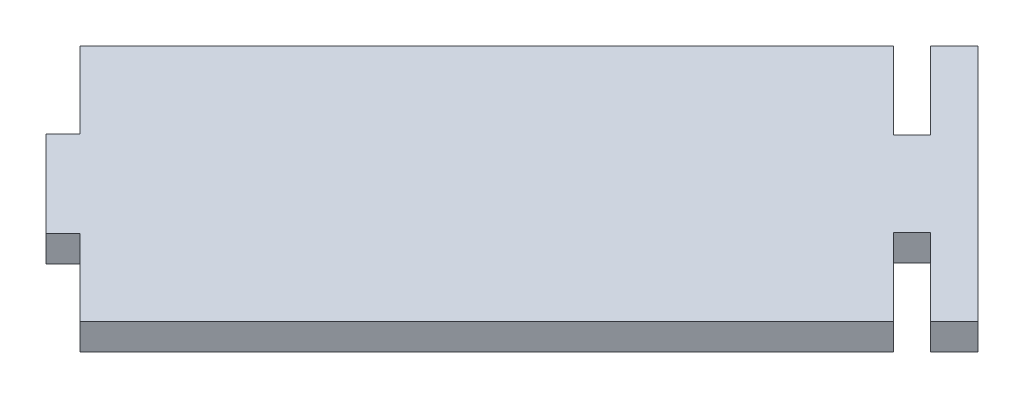
ISO-10303-21;
HEADER;
FILE_DESCRIPTION(('STEP AP214'),'2;1');
FILE_NAME('part.step','',(''),(''),'','','');
FILE_SCHEMA(('AUTOMOTIVE_DESIGN { 1 0 10303 214 1 1 1 1 }'));
ENDSEC;
DATA;
#1=APPLICATION_CONTEXT('core data for automotive mechanical design processes');
#2=APPLICATION_PROTOCOL_DEFINITION('international standard','automotive_design',2000,#1);
#3=PRODUCT_CONTEXT('',#1,'mechanical');
#4=PRODUCT('Part','Part','',(#3));
#5=PRODUCT_RELATED_PRODUCT_CATEGORY('part','',(#4));
#6=PRODUCT_DEFINITION_FORMATION('','',#4);
#7=PRODUCT_DEFINITION_CONTEXT('part definition',#1,'design');
#8=PRODUCT_DEFINITION('design','',#6,#7);
#9=PRODUCT_DEFINITION_SHAPE('','',#8);
#10=(LENGTH_UNIT() NAMED_UNIT(*) SI_UNIT(.MILLI.,.METRE.));
#11=(NAMED_UNIT(*) PLANE_ANGLE_UNIT() SI_UNIT($,.RADIAN.));
#12=(NAMED_UNIT(*) SI_UNIT($,.STERADIAN.) SOLID_ANGLE_UNIT());
#13=UNCERTAINTY_MEASURE_WITH_UNIT(LENGTH_MEASURE(1.E-05),#10,'distance_accuracy_value','');
#14=(GEOMETRIC_REPRESENTATION_CONTEXT(3) GLOBAL_UNCERTAINTY_ASSIGNED_CONTEXT((#13)) GLOBAL_UNIT_ASSIGNED_CONTEXT((#10,
#11,#12)) REPRESENTATION_CONTEXT('',''));
#15=CARTESIAN_POINT('',(0.,0.,0.));
#16=DIRECTION('',(0.,0.,1.));
#17=DIRECTION('',(1.,0.,0.));
#18=AXIS2_PLACEMENT_3D('',#15,#16,#17);
#19=CARTESIAN_POINT('',(28.0237135264483,2.2,28.0237135264482));
#20=DIRECTION('',(-0.707106781186549,0.,-0.707106781186546));
#21=DIRECTION('',(-0.707106781186546,0.,0.707106781186549));
#22=AXIS2_PLACEMENT_3D('',#19,#20,#21);
#23=PLANE('',#22);
#24=DIRECTION('',(0.707106781186546,0.,-0.707106781186549));
#25=VECTOR('',#24,1.);
#26=CARTESIAN_POINT('',(28.0237135264483,0.,28.0237135264482));
#27=LINE('',#26,#25);
#28=CARTESIAN_POINT('',(41.6576981747157,0.,14.3897288781808));
#29=VERTEX_POINT('',#28);
#30=CARTESIAN_POINT('',(43.0719117370887,0.,12.9755153158078));
#31=VERTEX_POINT('',#30);
#32=EDGE_CURVE('E182',#29,#31,#27,.T.);
#33=ORIENTED_EDGE('',*,*,#32,.T.);
#34=DIRECTION('',(0.,-1.,0.));
#35=VECTOR('',#34,1.);
#36=CARTESIAN_POINT('',(43.0719117370887,2.2,12.9755153158078));
#37=LINE('',#36,#35);
#38=CARTESIAN_POINT('',(43.0719117370887,2.2,12.9755153158078));
#39=VERTEX_POINT('',#38);
#40=EDGE_CURVE('E11',#39,#31,#37,.T.);
#41=ORIENTED_EDGE('',*,*,#40,.F.);
#42=DIRECTION('',(0.707106781186546,0.,-0.707106781186549));
#43=VECTOR('',#42,1.);
#44=CARTESIAN_POINT('',(28.0237135264483,2.2,28.0237135264482));
#45=LINE('',#44,#43);
#46=CARTESIAN_POINT('',(41.6576981747157,2.2,14.3897288781808));
#47=VERTEX_POINT('',#46);
#48=EDGE_CURVE('E223',#47,#39,#45,.T.);
#49=ORIENTED_EDGE('',*,*,#48,.F.);
#50=DIRECTION('',(0.,-1.,0.));
#51=VECTOR('',#50,1.);
#52=CARTESIAN_POINT('',(41.6576981747157,2.2,14.3897288781808));
#53=LINE('',#52,#51);
#54=EDGE_CURVE('E53',#47,#29,#53,.T.);
#55=ORIENTED_EDGE('',*,*,#54,.T.);
#56=EDGE_LOOP('',(#33,#41,#49,#55));
#57=FACE_BOUND('',#56,.T.);
#58=ADVANCED_FACE('F37',(#57),#23,.F.);
#59=CARTESIAN_POINT('',(15.0481982106404,2.2,-15.0481982106404));
#60=DIRECTION('',(0.707106781186547,0.,-0.707106781186548));
#61=DIRECTION('',(-0.707106781186548,0.,-0.707106781186547));
#62=AXIS2_PLACEMENT_3D('',#59,#60,#61);
#63=PLANE('',#62);
#64=DIRECTION('',(0.707106781186548,0.,0.707106781186547));
#65=VECTOR('',#64,1.);
#66=CARTESIAN_POINT('',(15.0481982106404,0.,-15.0481982106404));
#67=LINE('',#66,#65);
#68=CARTESIAN_POINT('',(49.4358727677676,0.,19.3394763464868));
#69=VERTEX_POINT('',#68);
#70=EDGE_CURVE('E184',#31,#69,#67,.T.);
#71=ORIENTED_EDGE('',*,*,#70,.T.);
#72=DIRECTION('',(0.,-1.,0.));
#73=VECTOR('',#72,1.);
#74=CARTESIAN_POINT('',(49.4358727677676,2.2,19.3394763464868));
#75=LINE('',#74,#73);
#76=CARTESIAN_POINT('',(49.4358727677676,2.2,19.3394763464868));
#77=VERTEX_POINT('',#76);
#78=EDGE_CURVE('E45',#77,#69,#75,.T.);
#79=ORIENTED_EDGE('',*,*,#78,.F.);
#80=DIRECTION('',(0.707106781186548,0.,0.707106781186547));
#81=VECTOR('',#80,1.);
#82=CARTESIAN_POINT('',(15.0481982106404,2.2,-15.0481982106404));
#83=LINE('',#82,#81);
#84=EDGE_CURVE('E116',#39,#77,#83,.T.);
#85=ORIENTED_EDGE('',*,*,#84,.F.);
#86=ORIENTED_EDGE('',*,*,#40,.T.);
#87=EDGE_LOOP('',(#71,#79,#85,#86));
#88=FACE_BOUND('',#87,.T.);
#89=ADVANCED_FACE('F304',(#88),#63,.F.);
#90=CARTESIAN_POINT('',(34.3876745571272,2.2,34.3876745571272));
#91=DIRECTION('',(-0.707106781186548,0.,-0.707106781186547));
#92=DIRECTION('',(-0.707106781186547,0.,0.707106781186548));
#93=AXIS2_PLACEMENT_3D('',#90,#91,#92);
#94=PLANE('',#93);
#95=DIRECTION('',(0.707106781186547,0.,-0.707106781186548));
#96=VECTOR('',#95,1.);
#97=CARTESIAN_POINT('',(34.3876745571272,0.,34.3876745571272));
#98=LINE('',#97,#96);
#99=CARTESIAN_POINT('',(83.3769982647219,0.,-14.6016491504675));
#100=VERTEX_POINT('',#99);
#101=EDGE_CURVE('E186',#69,#100,#98,.T.);
#102=ORIENTED_EDGE('',*,*,#101,.T.);
#103=DIRECTION('',(0.,-1.,0.));
#104=VECTOR('',#103,1.);
#105=CARTESIAN_POINT('',(83.3769982647219,2.2,-14.6016491504675));
#106=LINE('',#105,#104);
#107=CARTESIAN_POINT('',(83.3769982647219,2.2,-14.6016491504675));
#108=VERTEX_POINT('',#107);
#109=EDGE_CURVE('E247',#108,#100,#106,.T.);
#110=ORIENTED_EDGE('',*,*,#109,.F.);
#111=DIRECTION('',(0.707106781186547,0.,-0.707106781186548));
#112=VECTOR('',#111,1.);
#113=CARTESIAN_POINT('',(34.3876745571272,2.2,34.3876745571272));
#114=LINE('',#113,#112);
#115=EDGE_CURVE('E254',#77,#108,#114,.T.);
#116=ORIENTED_EDGE('',*,*,#115,.F.);
#117=ORIENTED_EDGE('',*,*,#78,.T.);
#118=EDGE_LOOP('',(#102,#110,#116,#117));
#119=FACE_BOUND('',#118,.T.);
#120=ADVANCED_FACE('F252',(#119),#94,.F.);
#121=CARTESIAN_POINT('',(48.9893237075947,2.2,-48.9893237075947));
#122=DIRECTION('',(0.707106781186548,0.,-0.707106781186547));
#123=DIRECTION('',(-0.707106781186547,0.,-0.707106781186548));
#124=AXIS2_PLACEMENT_3D('',#121,#122,#123);
#125=PLANE('',#124);
#126=DIRECTION('',(0.707106781186547,0.,0.707106781186548));
#127=VECTOR('',#126,1.);
#128=CARTESIAN_POINT('',(48.9893237075947,0.,-48.9893237075947));
#129=LINE('',#128,#127);
#130=CARTESIAN_POINT('',(76.9611400753651,0.,-21.0175073398244));
#131=VERTEX_POINT('',#130);
#132=EDGE_CURVE('E189',#131,#100,#129,.T.);
#133=ORIENTED_EDGE('',*,*,#132,.F.);
#134=DIRECTION('',(0.,-1.,0.));
#135=VECTOR('',#134,1.);
#136=CARTESIAN_POINT('',(76.9611400753651,2.2,-21.0175073398244));
#137=LINE('',#136,#135);
#138=CARTESIAN_POINT('',(76.9611400753651,2.2,-21.0175073398244));
#139=VERTEX_POINT('',#138);
#140=EDGE_CURVE('E245',#139,#131,#137,.T.);
#141=ORIENTED_EDGE('',*,*,#140,.F.);
#142=DIRECTION('',(0.707106781186547,0.,0.707106781186548));
#143=VECTOR('',#142,1.);
#144=CARTESIAN_POINT('',(48.9893237075947,2.2,-48.9893237075947));
#145=LINE('',#144,#143);
#146=EDGE_CURVE('E265',#139,#108,#145,.T.);
#147=ORIENTED_EDGE('',*,*,#146,.T.);
#148=ORIENTED_EDGE('',*,*,#109,.T.);
#149=EDGE_LOOP('',(#133,#141,#147,#148));
#150=FACE_BOUND('',#149,.T.);
#151=ADVANCED_FACE('F261',(#150),#125,.T.);
#152=CARTESIAN_POINT('',(27.9718163677703,2.2,27.9718163677703));
#153=DIRECTION('',(-0.707106781186548,0.,-0.707106781186548));
#154=DIRECTION('',(-0.707106781186548,0.,0.707106781186548));
#155=AXIS2_PLACEMENT_3D('',#152,#153,#154);
#156=PLANE('',#155);
#157=DIRECTION('',(0.707106781186548,0.,-0.707106781186548));
#158=VECTOR('',#157,1.);
#159=CARTESIAN_POINT('',(27.9718163677703,0.,27.9718163677703));
#160=LINE('',#159,#158);
#161=CARTESIAN_POINT('',(78.5167749939755,0.,-22.5731422584348));
#162=VERTEX_POINT('',#161);
#163=EDGE_CURVE('E192',#131,#162,#160,.T.);
#164=ORIENTED_EDGE('',*,*,#163,.T.);
#165=DIRECTION('',(0.,-1.,0.));
#166=VECTOR('',#165,1.);
#167=CARTESIAN_POINT('',(78.5167749939755,2.2,-22.5731422584348));
#168=LINE('',#167,#166);
#169=CARTESIAN_POINT('',(78.5167749939755,2.2,-22.5731422584348));
#170=VERTEX_POINT('',#169);
#171=EDGE_CURVE('E242',#170,#162,#168,.T.);
#172=ORIENTED_EDGE('',*,*,#171,.F.);
#173=DIRECTION('',(0.707106781186548,0.,-0.707106781186548));
#174=VECTOR('',#173,1.);
#175=CARTESIAN_POINT('',(27.9718163677703,2.2,27.9718163677703));
#176=LINE('',#175,#174);
#177=EDGE_CURVE('E266',#139,#170,#176,.T.);
#178=ORIENTED_EDGE('',*,*,#177,.F.);
#179=ORIENTED_EDGE('',*,*,#140,.T.);
#180=EDGE_LOOP('',(#164,#172,#178,#179));
#181=FACE_BOUND('',#180,.T.);
#182=ADVANCED_FACE('F317',(#181),#156,.F.);
#183=CARTESIAN_POINT('',(50.5449586262052,2.2,-50.5449586262051));
#184=DIRECTION('',(0.707106781186548,0.,-0.707106781186547));
#185=DIRECTION('',(-0.707106781186547,0.,-0.707106781186548));
#186=AXIS2_PLACEMENT_3D('',#183,#184,#185);
#187=PLANE('',#186);
#188=DIRECTION('',(0.707106781186547,0.,0.707106781186548));
#189=VECTOR('',#188,1.);
#190=CARTESIAN_POINT('',(50.5449586262052,0.,-50.5449586262051));
#191=LINE('',#190,#189);
#192=CARTESIAN_POINT('',(84.9326331833323,0.,-16.1572840690779));
#193=VERTEX_POINT('',#192);
#194=EDGE_CURVE('E194',#162,#193,#191,.T.);
#195=ORIENTED_EDGE('',*,*,#194,.T.);
#196=DIRECTION('',(0.,-1.,0.));
#197=VECTOR('',#196,1.);
#198=CARTESIAN_POINT('',(84.9326331833323,2.2,-16.1572840690779));
#199=LINE('',#198,#197);
#200=CARTESIAN_POINT('',(84.9326331833323,2.2,-16.1572840690779));
#201=VERTEX_POINT('',#200);
#202=EDGE_CURVE('E239',#201,#193,#199,.T.);
#203=ORIENTED_EDGE('',*,*,#202,.F.);
#204=DIRECTION('',(0.707106781186547,0.,0.707106781186548));
#205=VECTOR('',#204,1.);
#206=CARTESIAN_POINT('',(50.5449586262052,2.2,-50.5449586262051));
#207=LINE('',#206,#205);
#208=EDGE_CURVE('E268',#170,#201,#207,.T.);
#209=ORIENTED_EDGE('',*,*,#208,.F.);
#210=ORIENTED_EDGE('',*,*,#171,.T.);
#211=EDGE_LOOP('',(#195,#203,#209,#210));
#212=FACE_BOUND('',#211,.T.);
#213=ADVANCED_FACE('F320',(#212),#187,.F.);
#214=CARTESIAN_POINT('',(34.3876745571272,2.2,34.3876745571272));
#215=DIRECTION('',(-0.707106781186548,0.,-0.707106781186548));
#216=DIRECTION('',(-0.707106781186548,0.,0.707106781186548));
#217=AXIS2_PLACEMENT_3D('',#214,#215,#216);
#218=PLANE('',#217);
#219=DIRECTION('',(0.707106781186548,0.,-0.707106781186548));
#220=VECTOR('',#219,1.);
#221=CARTESIAN_POINT('',(34.3876745571272,0.,34.3876745571272));
#222=LINE('',#221,#220);
#223=CARTESIAN_POINT('',(86.9125321706547,0.,-18.1371830564003));
#224=VERTEX_POINT('',#223);
#225=EDGE_CURVE('E196',#193,#224,#222,.T.);
#226=ORIENTED_EDGE('',*,*,#225,.T.);
#227=DIRECTION('',(0.,-1.,0.));
#228=VECTOR('',#227,1.);
#229=CARTESIAN_POINT('',(86.9125321706547,2.2,-18.1371830564003));
#230=LINE('',#229,#228);
#231=CARTESIAN_POINT('',(86.9125321706547,2.2,-18.1371830564003));
#232=VERTEX_POINT('',#231);
#233=EDGE_CURVE('E237',#232,#224,#230,.T.);
#234=ORIENTED_EDGE('',*,*,#233,.F.);
#235=DIRECTION('',(0.707106781186548,0.,-0.707106781186548));
#236=VECTOR('',#235,1.);
#237=CARTESIAN_POINT('',(34.3876745571272,2.2,34.3876745571272));
#238=LINE('',#237,#236);
#239=EDGE_CURVE('E274',#201,#232,#238,.T.);
#240=ORIENTED_EDGE('',*,*,#239,.F.);
#241=ORIENTED_EDGE('',*,*,#202,.T.);
#242=EDGE_LOOP('',(#226,#234,#240,#241));
#243=FACE_BOUND('',#242,.T.);
#244=ADVANCED_FACE('F324',(#243),#218,.F.);
#245=CARTESIAN_POINT('',(52.5248576135275,2.2,-52.5248576135275));
#246=DIRECTION('',(0.707106781186548,0.,-0.707106781186548));
#247=DIRECTION('',(-0.707106781186548,0.,-0.707106781186548));
#248=AXIS2_PLACEMENT_3D('',#245,#246,#247);
#249=PLANE('',#248);
#250=DIRECTION('',(0.707106781186548,0.,0.707106781186548));
#251=VECTOR('',#250,1.);
#252=CARTESIAN_POINT('',(52.5248576135275,0.,-52.5248576135275));
#253=LINE('',#252,#251);
#254=CARTESIAN_POINT('',(67.0097479800751,0.,-38.0399672469798));
#255=VERTEX_POINT('',#254);
#256=EDGE_CURVE('E199',#255,#224,#253,.T.);
#257=ORIENTED_EDGE('',*,*,#256,.F.);
#258=DIRECTION('',(0.,-1.,0.));
#259=VECTOR('',#258,1.);
#260=CARTESIAN_POINT('',(67.0097479800751,2.2,-38.0399672469798));
#261=LINE('',#260,#259);
#262=CARTESIAN_POINT('',(67.0097479800751,2.2,-38.0399672469798));
#263=VERTEX_POINT('',#262);
#264=EDGE_CURVE('E235',#263,#255,#261,.T.);
#265=ORIENTED_EDGE('',*,*,#264,.F.);
#266=DIRECTION('',(0.707106781186548,0.,0.707106781186548));
#267=VECTOR('',#266,1.);
#268=CARTESIAN_POINT('',(52.5248576135275,2.2,-52.5248576135275));
#269=LINE('',#268,#267);
#270=EDGE_CURVE('E276',#263,#232,#269,.T.);
#271=ORIENTED_EDGE('',*,*,#270,.T.);
#272=ORIENTED_EDGE('',*,*,#233,.T.);
#273=EDGE_LOOP('',(#257,#265,#271,#272));
#274=FACE_BOUND('',#273,.T.);
#275=ADVANCED_FACE('F328',(#274),#249,.T.);
#276=CARTESIAN_POINT('',(14.4848903665476,2.2,14.4848903665476));
#277=DIRECTION('',(-0.707106781186548,0.,-0.707106781186548));
#278=DIRECTION('',(-0.707106781186548,0.,0.707106781186548));
#279=AXIS2_PLACEMENT_3D('',#276,#277,#278);
#280=PLANE('',#279);
#281=DIRECTION('',(0.707106781186548,0.,-0.707106781186548));
#282=VECTOR('',#281,1.);
#283=CARTESIAN_POINT('',(14.4848903665476,0.,14.4848903665476));
#284=LINE('',#283,#282);
#285=CARTESIAN_POINT('',(65.0298489927528,0.,-36.0600682596575));
#286=VERTEX_POINT('',#285);
#287=EDGE_CURVE('E202',#286,#255,#284,.T.);
#288=ORIENTED_EDGE('',*,*,#287,.F.);
#289=DIRECTION('',(0.,-1.,0.));
#290=VECTOR('',#289,1.);
#291=CARTESIAN_POINT('',(65.0298489927528,2.2,-36.0600682596575));
#292=LINE('',#291,#290);
#293=CARTESIAN_POINT('',(65.0298489927528,2.2,-36.0600682596575));
#294=VERTEX_POINT('',#293);
#295=EDGE_CURVE('E233',#294,#286,#292,.T.);
#296=ORIENTED_EDGE('',*,*,#295,.F.);
#297=DIRECTION('',(0.707106781186548,0.,-0.707106781186548));
#298=VECTOR('',#297,1.);
#299=CARTESIAN_POINT('',(14.4848903665476,2.2,14.4848903665476));
#300=LINE('',#299,#298);
#301=EDGE_CURVE('E279',#294,#263,#300,.T.);
#302=ORIENTED_EDGE('',*,*,#301,.T.);
#303=ORIENTED_EDGE('',*,*,#264,.T.);
#304=EDGE_LOOP('',(#288,#296,#302,#303));
#305=FACE_BOUND('',#304,.T.);
#306=ADVANCED_FACE('F332',(#305),#280,.T.);
#307=CARTESIAN_POINT('',(50.5449586262051,2.2,-50.5449586262051));
#308=DIRECTION('',(0.707106781186548,0.,-0.707106781186548));
#309=DIRECTION('',(-0.707106781186548,0.,-0.707106781186548));
#310=AXIS2_PLACEMENT_3D('',#307,#308,#309);
#311=PLANE('',#310);
#312=DIRECTION('',(0.707106781186548,0.,0.707106781186548));
#313=VECTOR('',#312,1.);
#314=CARTESIAN_POINT('',(50.5449586262051,0.,-50.5449586262051));
#315=LINE('',#314,#313);
#316=CARTESIAN_POINT('',(71.44570718211,0.,-29.6442100703003));
#317=VERTEX_POINT('',#316);
#318=EDGE_CURVE('E205',#286,#317,#315,.T.);
#319=ORIENTED_EDGE('',*,*,#318,.T.);
#320=DIRECTION('',(0.,-1.,0.));
#321=VECTOR('',#320,1.);
#322=CARTESIAN_POINT('',(71.44570718211,2.2,-29.6442100703003));
#323=LINE('',#322,#321);
#324=CARTESIAN_POINT('',(71.44570718211,2.2,-29.6442100703003));
#325=VERTEX_POINT('',#324);
#326=EDGE_CURVE('E231',#325,#317,#323,.T.);
#327=ORIENTED_EDGE('',*,*,#326,.F.);
#328=DIRECTION('',(0.707106781186548,0.,0.707106781186548));
#329=VECTOR('',#328,1.);
#330=CARTESIAN_POINT('',(50.5449586262051,2.2,-50.5449586262051));
#331=LINE('',#330,#329);
#332=EDGE_CURVE('E282',#294,#325,#331,.T.);
#333=ORIENTED_EDGE('',*,*,#332,.F.);
#334=ORIENTED_EDGE('',*,*,#295,.T.);
#335=EDGE_LOOP('',(#319,#327,#333,#334));
#336=FACE_BOUND('',#335,.T.);
#337=ADVANCED_FACE('F336',(#336),#311,.F.);
#338=CARTESIAN_POINT('',(20.9007485559048,2.2,20.9007485559048));
#339=DIRECTION('',(-0.707106781186548,0.,-0.707106781186548));
#340=DIRECTION('',(-0.707106781186548,0.,0.707106781186548));
#341=AXIS2_PLACEMENT_3D('',#338,#339,#340);
#342=PLANE('',#341);
#343=DIRECTION('',(0.707106781186548,0.,-0.707106781186548));
#344=VECTOR('',#343,1.);
#345=CARTESIAN_POINT('',(20.9007485559048,0.,20.9007485559048));
#346=LINE('',#345,#344);
#347=CARTESIAN_POINT('',(69.8900722634995,0.,-28.0885751516899));
#348=VERTEX_POINT('',#347);
#349=EDGE_CURVE('E208',#348,#317,#346,.T.);
#350=ORIENTED_EDGE('',*,*,#349,.F.);
#351=DIRECTION('',(0.,-1.,0.));
#352=VECTOR('',#351,1.);
#353=CARTESIAN_POINT('',(69.8900722634995,2.2,-28.0885751516899));
#354=LINE('',#353,#352);
#355=CARTESIAN_POINT('',(69.8900722634995,2.2,-28.0885751516899));
#356=VERTEX_POINT('',#355);
#357=EDGE_CURVE('E229',#356,#348,#354,.T.);
#358=ORIENTED_EDGE('',*,*,#357,.F.);
#359=DIRECTION('',(0.707106781186548,0.,-0.707106781186548));
#360=VECTOR('',#359,1.);
#361=CARTESIAN_POINT('',(20.9007485559048,2.2,20.9007485559048));
#362=LINE('',#361,#360);
#363=EDGE_CURVE('E284',#356,#325,#362,.T.);
#364=ORIENTED_EDGE('',*,*,#363,.T.);
#365=ORIENTED_EDGE('',*,*,#326,.T.);
#366=EDGE_LOOP('',(#350,#358,#364,#365));
#367=FACE_BOUND('',#366,.T.);
#368=ADVANCED_FACE('F340',(#367),#342,.T.);
#369=CARTESIAN_POINT('',(48.9893237075947,2.2,-48.9893237075947));
#370=DIRECTION('',(0.707106781186548,0.,-0.707106781186548));
#371=DIRECTION('',(-0.707106781186548,0.,-0.707106781186548));
#372=AXIS2_PLACEMENT_3D('',#369,#370,#371);
#373=PLANE('',#372);
#374=DIRECTION('',(0.707106781186548,0.,0.707106781186548));
#375=VECTOR('',#374,1.);
#376=CARTESIAN_POINT('',(48.9893237075947,0.,-48.9893237075947));
#377=LINE('',#376,#375);
#378=CARTESIAN_POINT('',(63.4742140741424,0.,-34.5044333410471));
#379=VERTEX_POINT('',#378);
#380=EDGE_CURVE('E211',#379,#348,#377,.T.);
#381=ORIENTED_EDGE('',*,*,#380,.F.);
#382=DIRECTION('',(0.,-1.,0.));
#383=VECTOR('',#382,1.);
#384=CARTESIAN_POINT('',(63.4742140741424,2.2,-34.5044333410471));
#385=LINE('',#384,#383);
#386=CARTESIAN_POINT('',(63.4742140741424,2.2,-34.5044333410471));
#387=VERTEX_POINT('',#386);
#388=EDGE_CURVE('E227',#387,#379,#385,.T.);
#389=ORIENTED_EDGE('',*,*,#388,.F.);
#390=DIRECTION('',(0.707106781186548,0.,0.707106781186548));
#391=VECTOR('',#390,1.);
#392=CARTESIAN_POINT('',(48.9893237075947,2.2,-48.9893237075947));
#393=LINE('',#392,#391);
#394=EDGE_CURVE('E287',#387,#356,#393,.T.);
#395=ORIENTED_EDGE('',*,*,#394,.T.);
#396=ORIENTED_EDGE('',*,*,#357,.T.);
#397=EDGE_LOOP('',(#381,#389,#395,#396));
#398=FACE_BOUND('',#397,.T.);
#399=ADVANCED_FACE('F344',(#398),#373,.T.);
#400=CARTESIAN_POINT('',(14.4848903665476,2.2,14.4848903665476));
#401=DIRECTION('',(-0.707106781186548,0.,-0.707106781186548));
#402=DIRECTION('',(-0.707106781186548,0.,0.707106781186548));
#403=AXIS2_PLACEMENT_3D('',#400,#401,#402);
#404=PLANE('',#403);
#405=DIRECTION('',(0.707106781186548,0.,-0.707106781186548));
#406=VECTOR('',#405,1.);
#407=CARTESIAN_POINT('',(14.4848903665476,0.,14.4848903665476));
#408=LINE('',#407,#406);
#409=CARTESIAN_POINT('',(29.5330885771881,0.,-0.56330784409282));
#410=VERTEX_POINT('',#409);
#411=EDGE_CURVE('E214',#410,#379,#408,.T.);
#412=ORIENTED_EDGE('',*,*,#411,.F.);
#413=DIRECTION('',(0.,-1.,0.));
#414=VECTOR('',#413,1.);
#415=CARTESIAN_POINT('',(29.5330885771881,2.2,-0.56330784409282));
#416=LINE('',#415,#414);
#417=CARTESIAN_POINT('',(29.5330885771881,2.2,-0.56330784409282));
#418=VERTEX_POINT('',#417);
#419=EDGE_CURVE('E174',#418,#410,#416,.T.);
#420=ORIENTED_EDGE('',*,*,#419,.F.);
#421=DIRECTION('',(0.707106781186548,0.,-0.707106781186548));
#422=VECTOR('',#421,1.);
#423=CARTESIAN_POINT('',(14.4848903665476,2.2,14.4848903665476));
#424=LINE('',#423,#422);
#425=EDGE_CURVE('E164',#418,#387,#424,.T.);
#426=ORIENTED_EDGE('',*,*,#425,.T.);
#427=ORIENTED_EDGE('',*,*,#388,.T.);
#428=EDGE_LOOP('',(#412,#420,#426,#427));
#429=FACE_BOUND('',#428,.T.);
#430=ADVANCED_FACE('F291',(#429),#404,.T.);
#431=CARTESIAN_POINT('',(15.0481982106405,2.2,-15.0481982106405));
#432=DIRECTION('',(0.707106781186548,0.,-0.707106781186548));
#433=DIRECTION('',(-0.707106781186548,0.,-0.707106781186548));
#434=AXIS2_PLACEMENT_3D('',#431,#432,#433);
#435=PLANE('',#434);
#436=DIRECTION('',(0.707106781186548,0.,0.707106781186548));
#437=VECTOR('',#436,1.);
#438=CARTESIAN_POINT('',(15.0481982106405,0.,-15.0481982106405));
#439=LINE('',#438,#437);
#440=CARTESIAN_POINT('',(35.897049607867,0.,5.80065318658611));
#441=VERTEX_POINT('',#440);
#442=EDGE_CURVE('E171',#410,#441,#439,.T.);
#443=ORIENTED_EDGE('',*,*,#442,.T.);
#444=DIRECTION('',(0.,-1.,0.));
#445=VECTOR('',#444,1.);
#446=CARTESIAN_POINT('',(35.897049607867,2.2,5.80065318658611));
#447=LINE('',#446,#445);
#448=CARTESIAN_POINT('',(35.897049607867,2.2,5.80065318658611));
#449=VERTEX_POINT('',#448);
#450=EDGE_CURVE('E168',#449,#441,#447,.T.);
#451=ORIENTED_EDGE('',*,*,#450,.F.);
#452=DIRECTION('',(0.707106781186548,0.,0.707106781186548));
#453=VECTOR('',#452,1.);
#454=CARTESIAN_POINT('',(15.0481982106405,2.2,-15.0481982106405));
#455=LINE('',#454,#453);
#456=EDGE_CURVE('E156',#418,#449,#455,.T.);
#457=ORIENTED_EDGE('',*,*,#456,.F.);
#458=ORIENTED_EDGE('',*,*,#419,.T.);
#459=EDGE_LOOP('',(#443,#451,#457,#458));
#460=FACE_BOUND('',#459,.T.);
#461=ADVANCED_FACE('F169',(#460),#435,.F.);
#462=CARTESIAN_POINT('',(20.8488513972266,2.2,20.8488513972266));
#463=DIRECTION('',(0.707106781186548,0.,0.707106781186548));
#464=DIRECTION('',(0.707106781186548,0.,-0.707106781186548));
#465=AXIS2_PLACEMENT_3D('',#462,#463,#464);
#466=PLANE('',#465);
#467=DIRECTION('',(-0.707106781186548,0.,0.707106781186548));
#468=VECTOR('',#467,1.);
#469=CARTESIAN_POINT('',(20.8488513972266,0.,20.8488513972266));
#470=LINE('',#469,#468);
#471=CARTESIAN_POINT('',(34.482836045494,0.,7.21486674895914));
#472=VERTEX_POINT('',#471);
#473=EDGE_CURVE('E218',#441,#472,#470,.T.);
#474=ORIENTED_EDGE('',*,*,#473,.T.);
#475=DIRECTION('',(0.,-1.,0.));
#476=VECTOR('',#475,1.);
#477=CARTESIAN_POINT('',(34.482836045494,2.2,7.21486674895914));
#478=LINE('',#477,#476);
#479=CARTESIAN_POINT('',(34.482836045494,2.2,7.21486674895914));
#480=VERTEX_POINT('',#479);
#481=EDGE_CURVE('E104',#480,#472,#478,.T.);
#482=ORIENTED_EDGE('',*,*,#481,.F.);
#483=DIRECTION('',(-0.707106781186548,0.,0.707106781186548));
#484=VECTOR('',#483,1.);
#485=CARTESIAN_POINT('',(20.8488513972266,2.2,20.8488513972266));
#486=LINE('',#485,#484);
#487=EDGE_CURVE('E161',#449,#480,#486,.T.);
#488=ORIENTED_EDGE('',*,*,#487,.F.);
#489=ORIENTED_EDGE('',*,*,#450,.T.);
#490=EDGE_LOOP('',(#474,#482,#488,#489));
#491=FACE_BOUND('',#490,.T.);
#492=ADVANCED_FACE('F176',(#491),#466,.F.);
#493=CARTESIAN_POINT('',(13.6339846482674,2.2,-13.6339846482674));
#494=DIRECTION('',(-0.707106781186548,0.,0.707106781186548));
#495=DIRECTION('',(0.707106781186548,0.,0.707106781186548));
#496=AXIS2_PLACEMENT_3D('',#493,#494,#495);
#497=PLANE('',#496);
#498=DIRECTION('',(-0.707106781186548,0.,-0.707106781186548));
#499=VECTOR('',#498,1.);
#500=CARTESIAN_POINT('',(13.6339846482674,0.,-13.6339846482674));
#501=LINE('',#500,#499);
#502=EDGE_CURVE('E220',#29,#472,#501,.T.);
#503=ORIENTED_EDGE('',*,*,#502,.F.);
#504=ORIENTED_EDGE('',*,*,#54,.F.);
#505=DIRECTION('',(-0.707106781186548,0.,-0.707106781186548));
#506=VECTOR('',#505,1.);
#507=CARTESIAN_POINT('',(13.6339846482674,2.2,-13.6339846482674));
#508=LINE('',#507,#506);
#509=EDGE_CURVE('E177',#47,#480,#508,.T.);
#510=ORIENTED_EDGE('',*,*,#509,.T.);
#511=ORIENTED_EDGE('',*,*,#481,.T.);
#512=EDGE_LOOP('',(#503,#504,#510,#511));
#513=FACE_BOUND('',#512,.T.);
#514=ADVANCED_FACE('F293',(#513),#497,.T.);
#515=CARTESIAN_POINT('',(0.,2.2,0.));
#516=DIRECTION('',(0.,1.,0.));
#517=DIRECTION('',(0.,0.,1.));
#518=AXIS2_PLACEMENT_3D('',#515,#516,#517);
#519=PLANE('',#518);
#520=ORIENTED_EDGE('',*,*,#48,.T.);
#521=ORIENTED_EDGE('',*,*,#84,.T.);
#522=ORIENTED_EDGE('',*,*,#115,.T.);
#523=ORIENTED_EDGE('',*,*,#146,.F.);
#524=ORIENTED_EDGE('',*,*,#177,.T.);
#525=ORIENTED_EDGE('',*,*,#208,.T.);
#526=ORIENTED_EDGE('',*,*,#239,.T.);
#527=ORIENTED_EDGE('',*,*,#270,.F.);
#528=ORIENTED_EDGE('',*,*,#301,.F.);
#529=ORIENTED_EDGE('',*,*,#332,.T.);
#530=ORIENTED_EDGE('',*,*,#363,.F.);
#531=ORIENTED_EDGE('',*,*,#394,.F.);
#532=ORIENTED_EDGE('',*,*,#425,.F.);
#533=ORIENTED_EDGE('',*,*,#456,.T.);
#534=ORIENTED_EDGE('',*,*,#487,.T.);
#535=ORIENTED_EDGE('',*,*,#509,.F.);
#536=EDGE_LOOP('',(#520,#521,#522,#523,#524,#525,#526,#527,#528,#529,#530,#531,#532,#533,#534,#535));
#537=FACE_BOUND('',#536,.T.);
#538=ADVANCED_FACE('F158',(#537),#519,.T.);
#539=CARTESIAN_POINT('',(0.,0.,0.));
#540=DIRECTION('',(0.,1.,0.));
#541=DIRECTION('',(0.,0.,1.));
#542=AXIS2_PLACEMENT_3D('',#539,#540,#541);
#543=PLANE('',#542);
#544=ORIENTED_EDGE('',*,*,#32,.F.);
#545=ORIENTED_EDGE('',*,*,#502,.T.);
#546=ORIENTED_EDGE('',*,*,#473,.F.);
#547=ORIENTED_EDGE('',*,*,#442,.F.);
#548=ORIENTED_EDGE('',*,*,#411,.T.);
#549=ORIENTED_EDGE('',*,*,#380,.T.);
#550=ORIENTED_EDGE('',*,*,#349,.T.);
#551=ORIENTED_EDGE('',*,*,#318,.F.);
#552=ORIENTED_EDGE('',*,*,#287,.T.);
#553=ORIENTED_EDGE('',*,*,#256,.T.);
#554=ORIENTED_EDGE('',*,*,#225,.F.);
#555=ORIENTED_EDGE('',*,*,#194,.F.);
#556=ORIENTED_EDGE('',*,*,#163,.F.);
#557=ORIENTED_EDGE('',*,*,#132,.T.);
#558=ORIENTED_EDGE('',*,*,#101,.F.);
#559=ORIENTED_EDGE('',*,*,#70,.F.);
#560=EDGE_LOOP('',(#544,#545,#546,#547,#548,#549,#550,#551,#552,#553,#554,#555,#556,#557,#558,#559));
#561=FACE_BOUND('',#560,.T.);
#562=ADVANCED_FACE('F256',(#561),#543,.F.);
#563=CLOSED_SHELL('',(#58,#89,#120,#151,#182,#213,#244,#275,#306,#337,#368,#399,#430,#461,#492,
#514,#538,#562));
#564=MANIFOLD_SOLID_BREP('B2',#563);
#565=ADVANCED_BREP_SHAPE_REPRESENTATION('',(#18,#564),#14);
#566=SHAPE_DEFINITION_REPRESENTATION(#9,#565);
ENDSEC;
END-ISO-10303-21;
